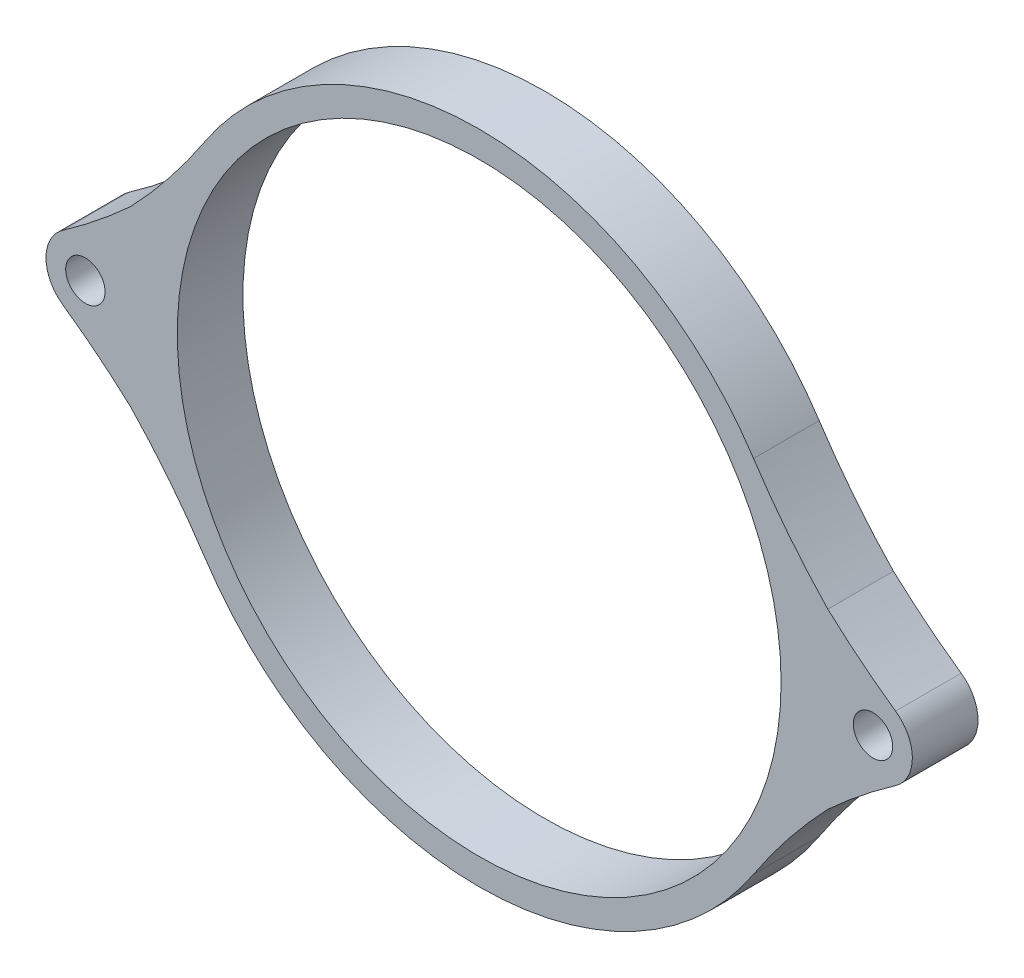
ISO-10303-21;
HEADER;
FILE_DESCRIPTION(('STEP AP214'),'2;1');
FILE_NAME('part.step','',(''),(''),'','','');
FILE_SCHEMA(('AUTOMOTIVE_DESIGN { 1 0 10303 214 1 1 1 1 }'));
ENDSEC;
DATA;
#1=APPLICATION_CONTEXT('core data for automotive mechanical design processes');
#2=APPLICATION_PROTOCOL_DEFINITION('international standard','automotive_design',2000,#1);
#3=PRODUCT_CONTEXT('',#1,'mechanical');
#4=PRODUCT('Part','Part','',(#3));
#5=PRODUCT_RELATED_PRODUCT_CATEGORY('part','',(#4));
#6=PRODUCT_DEFINITION_FORMATION('','',#4);
#7=PRODUCT_DEFINITION_CONTEXT('part definition',#1,'design');
#8=PRODUCT_DEFINITION('design','',#6,#7);
#9=PRODUCT_DEFINITION_SHAPE('','',#8);
#10=(LENGTH_UNIT() NAMED_UNIT(*) SI_UNIT(.MILLI.,.METRE.));
#11=(NAMED_UNIT(*) PLANE_ANGLE_UNIT() SI_UNIT($,.RADIAN.));
#12=(NAMED_UNIT(*) SI_UNIT($,.STERADIAN.) SOLID_ANGLE_UNIT());
#13=UNCERTAINTY_MEASURE_WITH_UNIT(LENGTH_MEASURE(1.E-05),#10,'distance_accuracy_value','');
#14=(GEOMETRIC_REPRESENTATION_CONTEXT(3) GLOBAL_UNCERTAINTY_ASSIGNED_CONTEXT((#13)) GLOBAL_UNIT_ASSIGNED_CONTEXT((#10,
#11,#12)) REPRESENTATION_CONTEXT('',''));
#15=CARTESIAN_POINT('',(0.,0.,0.));
#16=DIRECTION('',(0.,0.,1.));
#17=DIRECTION('',(1.,0.,0.));
#18=AXIS2_PLACEMENT_3D('',#15,#16,#17);
#19=CARTESIAN_POINT('',(0.,0.,5.));
#20=DIRECTION('',(0.,0.,-1.));
#21=DIRECTION('',(-1.,0.,0.));
#22=AXIS2_PLACEMENT_3D('',#19,#20,#21);
#23=CYLINDRICAL_SURFACE('',#22,25.);
#24=CARTESIAN_POINT('',(0.,0.,5.));
#25=DIRECTION('',(0.,0.,1.));
#26=DIRECTION('',(1.,0.,0.));
#27=AXIS2_PLACEMENT_3D('',#24,#25,#26);
#28=CIRCLE('',#27,25.);
#29=CARTESIAN_POINT('',(20.9015909610974,13.7158118715216,5.));
#30=VERTEX_POINT('',#29);
#31=CARTESIAN_POINT('',(-20.9015909610974,13.7158118715216,5.));
#32=VERTEX_POINT('',#31);
#33=EDGE_CURVE('E247',#30,#32,#28,.T.);
#34=ORIENTED_EDGE('',*,*,#33,.F.);
#35=DIRECTION('',(0.,0.,-1.));
#36=VECTOR('',#35,1.);
#37=CARTESIAN_POINT('',(20.9015909610974,13.7158118715216,5.));
#38=LINE('',#37,#36);
#39=CARTESIAN_POINT('',(20.9015909610974,13.7158118715216,0.));
#40=VERTEX_POINT('',#39);
#41=EDGE_CURVE('E170',#30,#40,#38,.T.);
#42=ORIENTED_EDGE('',*,*,#41,.T.);
#43=CARTESIAN_POINT('',(0.,0.,0.));
#44=DIRECTION('',(0.,0.,1.));
#45=DIRECTION('',(1.,0.,0.));
#46=AXIS2_PLACEMENT_3D('',#43,#44,#45);
#47=CIRCLE('',#46,25.);
#48=CARTESIAN_POINT('',(-20.9015909610974,13.7158118715216,0.));
#49=VERTEX_POINT('',#48);
#50=EDGE_CURVE('E216',#40,#49,#47,.T.);
#51=ORIENTED_EDGE('',*,*,#50,.T.);
#52=DIRECTION('',(0.,0.,-1.));
#53=VECTOR('',#52,1.);
#54=CARTESIAN_POINT('',(-20.9015909610974,13.7158118715216,5.));
#55=LINE('',#54,#53);
#56=EDGE_CURVE('E168',#49,#32,#55,.F.);
#57=ORIENTED_EDGE('',*,*,#56,.T.);
#58=EDGE_LOOP('',(#34,#42,#51,#57));
#59=FACE_BOUND('',#58,.T.);
#60=ADVANCED_FACE('F38',(#59),#23,.T.);
#61=CARTESIAN_POINT('',(-30.,0.,5.));
#62=DIRECTION('',(0.,0.,-1.));
#63=DIRECTION('',(-1.,0.,0.));
#64=AXIS2_PLACEMENT_3D('',#61,#62,#63);
#65=CYLINDRICAL_SURFACE('',#64,3.);
#66=CARTESIAN_POINT('',(-30.,0.,5.));
#67=DIRECTION('',(0.,0.,1.));
#68=DIRECTION('',(1.,0.,0.));
#69=AXIS2_PLACEMENT_3D('',#66,#67,#68);
#70=CIRCLE('',#69,3.);
#71=CARTESIAN_POINT('',(-31.7190766718324,2.45861249414417,5.));
#72=VERTEX_POINT('',#71);
#73=CARTESIAN_POINT('',(-31.7190766718324,-2.45861249414417,5.));
#74=VERTEX_POINT('',#73);
#75=EDGE_CURVE('E225',#72,#74,#70,.T.);
#76=ORIENTED_EDGE('',*,*,#75,.F.);
#77=DIRECTION('',(0.,0.,-1.));
#78=VECTOR('',#77,1.);
#79=CARTESIAN_POINT('',(-31.7190766718324,2.45861249414417,5.));
#80=LINE('',#79,#78);
#81=CARTESIAN_POINT('',(-31.7190766718324,2.45861249414417,0.));
#82=VERTEX_POINT('',#81);
#83=EDGE_CURVE('E141',#72,#82,#80,.T.);
#84=ORIENTED_EDGE('',*,*,#83,.T.);
#85=CARTESIAN_POINT('',(-30.,0.,0.));
#86=DIRECTION('',(0.,0.,1.));
#87=DIRECTION('',(1.,0.,0.));
#88=AXIS2_PLACEMENT_3D('',#85,#86,#87);
#89=CIRCLE('',#88,3.);
#90=CARTESIAN_POINT('',(-31.7190766718324,-2.45861249414417,0.));
#91=VERTEX_POINT('',#90);
#92=EDGE_CURVE('E210',#82,#91,#89,.T.);
#93=ORIENTED_EDGE('',*,*,#92,.T.);
#94=DIRECTION('',(0.,0.,-1.));
#95=VECTOR('',#94,1.);
#96=CARTESIAN_POINT('',(-31.7190766718324,-2.45861249414417,5.));
#97=LINE('',#96,#95);
#98=EDGE_CURVE('E53',#91,#74,#97,.F.);
#99=ORIENTED_EDGE('',*,*,#98,.T.);
#100=EDGE_LOOP('',(#76,#84,#93,#99));
#101=FACE_BOUND('',#100,.T.);
#102=ADVANCED_FACE('F213',(#101),#65,.T.);
#103=CARTESIAN_POINT('',(-20.9015909610974,-13.7158118715216,0.));
#104=VERTEX_POINT('',#103);
#105=CARTESIAN_POINT('',(20.9015909610974,-13.7158118715216,0.));
#106=VERTEX_POINT('',#105);
#107=EDGE_CURVE('E215',#104,#106,#47,.T.);
#108=ORIENTED_EDGE('',*,*,#107,.T.);
#109=DIRECTION('',(0.,0.,-1.));
#110=VECTOR('',#109,1.);
#111=CARTESIAN_POINT('',(20.9015909610974,-13.7158118715216,5.));
#112=LINE('',#111,#110);
#113=CARTESIAN_POINT('',(20.9015909610974,-13.7158118715216,5.));
#114=VERTEX_POINT('',#113);
#115=EDGE_CURVE('E150',#106,#114,#112,.F.);
#116=ORIENTED_EDGE('',*,*,#115,.T.);
#117=CARTESIAN_POINT('',(-20.9015909610974,-13.7158118715216,5.));
#118=VERTEX_POINT('',#117);
#119=EDGE_CURVE('E231',#118,#114,#28,.T.);
#120=ORIENTED_EDGE('',*,*,#119,.F.);
#121=DIRECTION('',(0.,0.,-1.));
#122=VECTOR('',#121,1.);
#123=CARTESIAN_POINT('',(-20.9015909610974,-13.7158118715216,5.));
#124=LINE('',#123,#122);
#125=EDGE_CURVE('E155',#118,#104,#124,.T.);
#126=ORIENTED_EDGE('',*,*,#125,.T.);
#127=EDGE_LOOP('',(#108,#116,#120,#126));
#128=FACE_BOUND('',#127,.T.);
#129=ADVANCED_FACE('F230',(#128),#23,.T.);
#130=CARTESIAN_POINT('',(30.,0.,5.));
#131=DIRECTION('',(0.,0.,-1.));
#132=DIRECTION('',(-1.,0.,0.));
#133=AXIS2_PLACEMENT_3D('',#130,#131,#132);
#134=CYLINDRICAL_SURFACE('',#133,1.5);
#135=CARTESIAN_POINT('',(30.,0.,5.));
#136=DIRECTION('',(0.,0.,1.));
#137=DIRECTION('',(1.,0.,0.));
#138=AXIS2_PLACEMENT_3D('',#135,#136,#137);
#139=CIRCLE('',#138,1.5);
#140=CARTESIAN_POINT('',(31.5,0.,5.));
#141=VERTEX_POINT('',#140);
#142=EDGE_CURVE('E161',#141,#141,#139,.T.);
#143=ORIENTED_EDGE('',*,*,#142,.T.);
#144=EDGE_LOOP('',(#143));
#145=FACE_BOUND('',#144,.T.);
#146=CARTESIAN_POINT('',(30.,0.,0.));
#147=DIRECTION('',(0.,0.,1.));
#148=DIRECTION('',(1.,0.,0.));
#149=AXIS2_PLACEMENT_3D('',#146,#147,#148);
#150=CIRCLE('',#149,1.5);
#151=CARTESIAN_POINT('',(31.5,0.,0.));
#152=VERTEX_POINT('',#151);
#153=EDGE_CURVE('E252',#152,#152,#150,.T.);
#154=ORIENTED_EDGE('',*,*,#153,.F.);
#155=EDGE_LOOP('',(#154));
#156=FACE_BOUND('',#155,.T.);
#157=ADVANCED_FACE('F264',(#145,#156),#134,.F.);
#158=CARTESIAN_POINT('',(0.,0.,5.));
#159=DIRECTION('',(0.,0.,-1.));
#160=DIRECTION('',(-1.,0.,0.));
#161=AXIS2_PLACEMENT_3D('',#158,#159,#160);
#162=CYLINDRICAL_SURFACE('',#161,23.);
#163=CARTESIAN_POINT('',(0.,0.,5.));
#164=DIRECTION('',(0.,0.,1.));
#165=DIRECTION('',(1.,0.,0.));
#166=AXIS2_PLACEMENT_3D('',#163,#164,#165);
#167=CIRCLE('',#166,23.);
#168=CARTESIAN_POINT('',(23.,0.,5.));
#169=VERTEX_POINT('',#168);
#170=EDGE_CURVE('E254',#169,#169,#167,.T.);
#171=ORIENTED_EDGE('',*,*,#170,.T.);
#172=EDGE_LOOP('',(#171));
#173=FACE_BOUND('',#172,.T.);
#174=CARTESIAN_POINT('',(0.,0.,0.));
#175=DIRECTION('',(0.,0.,1.));
#176=DIRECTION('',(1.,0.,0.));
#177=AXIS2_PLACEMENT_3D('',#174,#175,#176);
#178=CIRCLE('',#177,23.);
#179=CARTESIAN_POINT('',(23.,0.,0.));
#180=VERTEX_POINT('',#179);
#181=EDGE_CURVE('E233',#180,#180,#178,.T.);
#182=ORIENTED_EDGE('',*,*,#181,.F.);
#183=EDGE_LOOP('',(#182));
#184=FACE_BOUND('',#183,.T.);
#185=ADVANCED_FACE('F297',(#173,#184),#162,.F.);
#186=CARTESIAN_POINT('',(30.,0.,5.));
#187=DIRECTION('',(0.,0.,-1.));
#188=DIRECTION('',(-1.,0.,0.));
#189=AXIS2_PLACEMENT_3D('',#186,#187,#188);
#190=CYLINDRICAL_SURFACE('',#189,3.);
#191=CARTESIAN_POINT('',(30.,0.,5.));
#192=DIRECTION('',(0.,0.,1.));
#193=DIRECTION('',(1.,0.,0.));
#194=AXIS2_PLACEMENT_3D('',#191,#192,#193);
#195=CIRCLE('',#194,3.);
#196=CARTESIAN_POINT('',(31.7190766718324,-2.45861249414417,5.));
#197=VERTEX_POINT('',#196);
#198=CARTESIAN_POINT('',(31.7190766718324,2.45861249414417,5.));
#199=VERTEX_POINT('',#198);
#200=EDGE_CURVE('E253',#197,#199,#195,.T.);
#201=ORIENTED_EDGE('',*,*,#200,.F.);
#202=DIRECTION('',(0.,0.,-1.));
#203=VECTOR('',#202,1.);
#204=CARTESIAN_POINT('',(31.7190766718324,-2.45861249414417,5.));
#205=LINE('',#204,#203);
#206=CARTESIAN_POINT('',(31.7190766718324,-2.45861249414417,0.));
#207=VERTEX_POINT('',#206);
#208=EDGE_CURVE('E197',#197,#207,#205,.T.);
#209=ORIENTED_EDGE('',*,*,#208,.T.);
#210=CARTESIAN_POINT('',(30.,0.,0.));
#211=DIRECTION('',(0.,0.,1.));
#212=DIRECTION('',(1.,0.,0.));
#213=AXIS2_PLACEMENT_3D('',#210,#211,#212);
#214=CIRCLE('',#213,3.);
#215=CARTESIAN_POINT('',(31.7190766718324,2.45861249414417,0.));
#216=VERTEX_POINT('',#215);
#217=EDGE_CURVE('E135',#207,#216,#214,.T.);
#218=ORIENTED_EDGE('',*,*,#217,.T.);
#219=DIRECTION('',(0.,0.,-1.));
#220=VECTOR('',#219,1.);
#221=CARTESIAN_POINT('',(31.7190766718324,2.45861249414417,5.));
#222=LINE('',#221,#220);
#223=EDGE_CURVE('E195',#216,#199,#222,.F.);
#224=ORIENTED_EDGE('',*,*,#223,.T.);
#225=EDGE_LOOP('',(#201,#209,#218,#224));
#226=FACE_BOUND('',#225,.T.);
#227=ADVANCED_FACE('F275',(#226),#190,.T.);
#228=CARTESIAN_POINT('',(-30.,0.,5.));
#229=DIRECTION('',(0.,0.,-1.));
#230=DIRECTION('',(-1.,0.,0.));
#231=AXIS2_PLACEMENT_3D('',#228,#229,#230);
#232=CYLINDRICAL_SURFACE('',#231,1.5);
#233=CARTESIAN_POINT('',(-30.,0.,5.));
#234=DIRECTION('',(0.,0.,1.));
#235=DIRECTION('',(1.,0.,0.));
#236=AXIS2_PLACEMENT_3D('',#233,#234,#235);
#237=CIRCLE('',#236,1.5);
#238=CARTESIAN_POINT('',(-28.5,0.,5.));
#239=VERTEX_POINT('',#238);
#240=EDGE_CURVE('E156',#239,#239,#237,.T.);
#241=ORIENTED_EDGE('',*,*,#240,.T.);
#242=EDGE_LOOP('',(#241));
#243=FACE_BOUND('',#242,.T.);
#244=CARTESIAN_POINT('',(-30.,0.,0.));
#245=DIRECTION('',(0.,0.,1.));
#246=DIRECTION('',(1.,0.,0.));
#247=AXIS2_PLACEMENT_3D('',#244,#245,#246);
#248=CIRCLE('',#247,1.5);
#249=CARTESIAN_POINT('',(-28.5,0.,0.));
#250=VERTEX_POINT('',#249);
#251=EDGE_CURVE('E164',#250,#250,#248,.T.);
#252=ORIENTED_EDGE('',*,*,#251,.F.);
#253=EDGE_LOOP('',(#252));
#254=FACE_BOUND('',#253,.T.);
#255=ADVANCED_FACE('F269',(#243,#254),#232,.F.);
#256=CARTESIAN_POINT('',(0.,0.,5.));
#257=DIRECTION('',(0.,0.,1.));
#258=DIRECTION('',(1.,0.,0.));
#259=AXIS2_PLACEMENT_3D('',#256,#257,#258);
#260=PLANE('',#259);
#261=ORIENTED_EDGE('',*,*,#200,.T.);
#262=CARTESIAN_POINT('',(60.3703545357049,43.4354873965469,5.));
#263=DIRECTION('',(0.,0.,1.));
#264=DIRECTION('',(1.,0.,0.));
#265=AXIS2_PLACEMENT_3D('',#262,#263,#264);
#266=CIRCLE('',#265,50.);
#267=CARTESIAN_POINT('',(26.5573264001823,6.60236197517717,5.));
#268=VERTEX_POINT('',#267);
#269=EDGE_CURVE('E205',#199,#268,#266,.F.);
#270=ORIENTED_EDGE('',*,*,#269,.T.);
#271=CARTESIAN_POINT('',(62.7047728832921,41.1474356145648,5.));
#272=DIRECTION('',(0.,0.,1.));
#273=DIRECTION('',(1.,0.,0.));
#274=AXIS2_PLACEMENT_3D('',#271,#272,#273);
#275=CIRCLE('',#274,50.);
#276=EDGE_CURVE('E184',#268,#30,#275,.F.);
#277=ORIENTED_EDGE('',*,*,#276,.T.);
#278=ORIENTED_EDGE('',*,*,#33,.T.);
#279=CARTESIAN_POINT('',(-62.7047728832921,41.1474356145648,5.));
#280=DIRECTION('',(0.,0.,1.));
#281=DIRECTION('',(1.,0.,0.));
#282=AXIS2_PLACEMENT_3D('',#279,#280,#281);
#283=CIRCLE('',#282,50.);
#284=CARTESIAN_POINT('',(-26.5573264001823,6.60236197517717,5.));
#285=VERTEX_POINT('',#284);
#286=EDGE_CURVE('E188',#32,#285,#283,.F.);
#287=ORIENTED_EDGE('',*,*,#286,.T.);
#288=CARTESIAN_POINT('',(-60.3703545357049,43.4354873965469,5.));
#289=DIRECTION('',(0.,0.,1.));
#290=DIRECTION('',(1.,0.,0.));
#291=AXIS2_PLACEMENT_3D('',#288,#289,#290);
#292=CIRCLE('',#291,50.);
#293=EDGE_CURVE('E60',#285,#72,#292,.F.);
#294=ORIENTED_EDGE('',*,*,#293,.T.);
#295=ORIENTED_EDGE('',*,*,#75,.T.);
#296=CARTESIAN_POINT('',(-60.3703545357049,-43.4354873965469,5.));
#297=DIRECTION('',(0.,0.,1.));
#298=DIRECTION('',(1.,0.,0.));
#299=AXIS2_PLACEMENT_3D('',#296,#297,#298);
#300=CIRCLE('',#299,50.);
#301=CARTESIAN_POINT('',(-26.5573264001823,-6.60236197517717,5.));
#302=VERTEX_POINT('',#301);
#303=EDGE_CURVE('E11',#74,#302,#300,.F.);
#304=ORIENTED_EDGE('',*,*,#303,.T.);
#305=CARTESIAN_POINT('',(-62.7047728832921,-41.1474356145648,5.));
#306=DIRECTION('',(0.,0.,1.));
#307=DIRECTION('',(1.,0.,0.));
#308=AXIS2_PLACEMENT_3D('',#305,#306,#307);
#309=CIRCLE('',#308,50.);
#310=EDGE_CURVE('E193',#302,#118,#309,.F.);
#311=ORIENTED_EDGE('',*,*,#310,.T.);
#312=ORIENTED_EDGE('',*,*,#119,.T.);
#313=CARTESIAN_POINT('',(62.7047728832921,-41.1474356145648,5.));
#314=DIRECTION('',(0.,0.,1.));
#315=DIRECTION('',(1.,0.,0.));
#316=AXIS2_PLACEMENT_3D('',#313,#314,#315);
#317=CIRCLE('',#316,50.);
#318=CARTESIAN_POINT('',(26.5573264001823,-6.60236197517717,5.));
#319=VERTEX_POINT('',#318);
#320=EDGE_CURVE('E151',#114,#319,#317,.F.);
#321=ORIENTED_EDGE('',*,*,#320,.T.);
#322=CARTESIAN_POINT('',(60.3703545357049,-43.4354873965469,5.));
#323=DIRECTION('',(0.,0.,1.));
#324=DIRECTION('',(1.,0.,0.));
#325=AXIS2_PLACEMENT_3D('',#322,#323,#324);
#326=CIRCLE('',#325,50.);
#327=EDGE_CURVE('E140',#319,#197,#326,.F.);
#328=ORIENTED_EDGE('',*,*,#327,.T.);
#329=EDGE_LOOP('',(#261,#270,#277,#278,#287,#294,#295,#304,#311,#312,#321,#328));
#330=FACE_BOUND('',#329,.T.);
#331=ORIENTED_EDGE('',*,*,#170,.F.);
#332=EDGE_LOOP('',(#331));
#333=FACE_BOUND('',#332,.T.);
#334=ORIENTED_EDGE('',*,*,#142,.F.);
#335=EDGE_LOOP('',(#334));
#336=FACE_BOUND('',#335,.T.);
#337=ORIENTED_EDGE('',*,*,#240,.F.);
#338=EDGE_LOOP('',(#337));
#339=FACE_BOUND('',#338,.T.);
#340=ADVANCED_FACE('F221',(#330,#333,#336,#339),#260,.T.);
#341=CARTESIAN_POINT('',(0.,0.,0.));
#342=DIRECTION('',(0.,0.,1.));
#343=DIRECTION('',(1.,0.,0.));
#344=AXIS2_PLACEMENT_3D('',#341,#342,#343);
#345=PLANE('',#344);
#346=CARTESIAN_POINT('',(62.7047728832921,41.1474356145648,0.));
#347=DIRECTION('',(0.,0.,1.));
#348=DIRECTION('',(1.,0.,0.));
#349=AXIS2_PLACEMENT_3D('',#346,#347,#348);
#350=CIRCLE('',#349,50.);
#351=CARTESIAN_POINT('',(26.5573264001823,6.60236197517717,0.));
#352=VERTEX_POINT('',#351);
#353=EDGE_CURVE('E182',#40,#352,#350,.T.);
#354=ORIENTED_EDGE('',*,*,#353,.T.);
#355=CARTESIAN_POINT('',(60.3703545357049,43.4354873965469,0.));
#356=DIRECTION('',(0.,0.,1.));
#357=DIRECTION('',(1.,0.,0.));
#358=AXIS2_PLACEMENT_3D('',#355,#356,#357);
#359=CIRCLE('',#358,50.);
#360=EDGE_CURVE('E203',#352,#216,#359,.T.);
#361=ORIENTED_EDGE('',*,*,#360,.T.);
#362=ORIENTED_EDGE('',*,*,#217,.F.);
#363=CARTESIAN_POINT('',(60.3703545357049,-43.4354873965469,0.));
#364=DIRECTION('',(0.,0.,1.));
#365=DIRECTION('',(1.,0.,0.));
#366=AXIS2_PLACEMENT_3D('',#363,#364,#365);
#367=CIRCLE('',#366,50.);
#368=CARTESIAN_POINT('',(26.5573264001823,-6.60236197517717,0.));
#369=VERTEX_POINT('',#368);
#370=EDGE_CURVE('E126',#207,#369,#367,.T.);
#371=ORIENTED_EDGE('',*,*,#370,.T.);
#372=CARTESIAN_POINT('',(62.7047728832921,-41.1474356145648,0.));
#373=DIRECTION('',(0.,0.,1.));
#374=DIRECTION('',(1.,0.,0.));
#375=AXIS2_PLACEMENT_3D('',#372,#373,#374);
#376=CIRCLE('',#375,50.);
#377=EDGE_CURVE('E132',#369,#106,#376,.T.);
#378=ORIENTED_EDGE('',*,*,#377,.T.);
#379=ORIENTED_EDGE('',*,*,#107,.F.);
#380=CARTESIAN_POINT('',(-62.7047728832921,-41.1474356145648,0.));
#381=DIRECTION('',(0.,0.,1.));
#382=DIRECTION('',(1.,0.,0.));
#383=AXIS2_PLACEMENT_3D('',#380,#381,#382);
#384=CIRCLE('',#383,50.);
#385=CARTESIAN_POINT('',(-26.5573264001823,-6.60236197517717,0.));
#386=VERTEX_POINT('',#385);
#387=EDGE_CURVE('E190',#104,#386,#384,.T.);
#388=ORIENTED_EDGE('',*,*,#387,.T.);
#389=CARTESIAN_POINT('',(-60.3703545357049,-43.4354873965469,0.));
#390=DIRECTION('',(0.,0.,1.));
#391=DIRECTION('',(1.,0.,0.));
#392=AXIS2_PLACEMENT_3D('',#389,#390,#391);
#393=CIRCLE('',#392,50.);
#394=EDGE_CURVE('E46',#386,#91,#393,.T.);
#395=ORIENTED_EDGE('',*,*,#394,.T.);
#396=ORIENTED_EDGE('',*,*,#92,.F.);
#397=CARTESIAN_POINT('',(-60.3703545357049,43.4354873965469,0.));
#398=DIRECTION('',(0.,0.,1.));
#399=DIRECTION('',(1.,0.,0.));
#400=AXIS2_PLACEMENT_3D('',#397,#398,#399);
#401=CIRCLE('',#400,50.);
#402=CARTESIAN_POINT('',(-26.5573264001823,6.60236197517717,0.));
#403=VERTEX_POINT('',#402);
#404=EDGE_CURVE('E207',#82,#403,#401,.T.);
#405=ORIENTED_EDGE('',*,*,#404,.T.);
#406=CARTESIAN_POINT('',(-62.7047728832921,41.1474356145648,0.));
#407=DIRECTION('',(0.,0.,1.));
#408=DIRECTION('',(1.,0.,0.));
#409=AXIS2_PLACEMENT_3D('',#406,#407,#408);
#410=CIRCLE('',#409,50.);
#411=EDGE_CURVE('E186',#403,#49,#410,.T.);
#412=ORIENTED_EDGE('',*,*,#411,.T.);
#413=ORIENTED_EDGE('',*,*,#50,.F.);
#414=EDGE_LOOP('',(#354,#361,#362,#371,#378,#379,#388,#395,#396,#405,#412,#413));
#415=FACE_BOUND('',#414,.T.);
#416=ORIENTED_EDGE('',*,*,#181,.T.);
#417=EDGE_LOOP('',(#416));
#418=FACE_BOUND('',#417,.T.);
#419=ORIENTED_EDGE('',*,*,#153,.T.);
#420=EDGE_LOOP('',(#419));
#421=FACE_BOUND('',#420,.T.);
#422=ORIENTED_EDGE('',*,*,#251,.T.);
#423=EDGE_LOOP('',(#422));
#424=FACE_BOUND('',#423,.T.);
#425=ADVANCED_FACE('F129',(#415,#418,#421,#424),#345,.F.);
#426=CARTESIAN_POINT('',(62.7047728832921,-41.1474356145648,5.));
#427=DIRECTION('',(0.,0.,-1.));
#428=DIRECTION('',(-1.,0.,0.));
#429=AXIS2_PLACEMENT_3D('',#426,#427,#428);
#430=CYLINDRICAL_SURFACE('',#429,50.);
#431=ORIENTED_EDGE('',*,*,#320,.F.);
#432=ORIENTED_EDGE('',*,*,#115,.F.);
#433=ORIENTED_EDGE('',*,*,#377,.F.);
#434=DIRECTION('',(0.,0.,-1.));
#435=VECTOR('',#434,1.);
#436=CARTESIAN_POINT('',(26.5573264001823,-6.60236197517717,5.));
#437=LINE('',#436,#435);
#438=EDGE_CURVE('E148',#319,#369,#437,.T.);
#439=ORIENTED_EDGE('',*,*,#438,.F.);
#440=EDGE_LOOP('',(#431,#432,#433,#439));
#441=FACE_BOUND('',#440,.T.);
#442=ADVANCED_FACE('F147',(#441),#430,.F.);
#443=CARTESIAN_POINT('',(62.7047728832921,41.1474356145648,5.));
#444=DIRECTION('',(0.,0.,-1.));
#445=DIRECTION('',(-1.,0.,0.));
#446=AXIS2_PLACEMENT_3D('',#443,#444,#445);
#447=CYLINDRICAL_SURFACE('',#446,50.);
#448=ORIENTED_EDGE('',*,*,#276,.F.);
#449=DIRECTION('',(0.,0.,1.));
#450=VECTOR('',#449,1.);
#451=CARTESIAN_POINT('',(26.5573264001823,6.60236197517717,5.));
#452=LINE('',#451,#450);
#453=EDGE_CURVE('E173',#352,#268,#452,.T.);
#454=ORIENTED_EDGE('',*,*,#453,.F.);
#455=ORIENTED_EDGE('',*,*,#353,.F.);
#456=ORIENTED_EDGE('',*,*,#41,.F.);
#457=EDGE_LOOP('',(#448,#454,#455,#456));
#458=FACE_BOUND('',#457,.T.);
#459=ADVANCED_FACE('F284',(#458),#447,.F.);
#460=CARTESIAN_POINT('',(-62.7047728832921,41.1474356145648,5.));
#461=DIRECTION('',(0.,0.,-1.));
#462=DIRECTION('',(-1.,0.,0.));
#463=AXIS2_PLACEMENT_3D('',#460,#461,#462);
#464=CYLINDRICAL_SURFACE('',#463,50.);
#465=ORIENTED_EDGE('',*,*,#286,.F.);
#466=ORIENTED_EDGE('',*,*,#56,.F.);
#467=ORIENTED_EDGE('',*,*,#411,.F.);
#468=DIRECTION('',(0.,0.,-1.));
#469=VECTOR('',#468,1.);
#470=CARTESIAN_POINT('',(-26.5573264001823,6.60236197517717,5.));
#471=LINE('',#470,#469);
#472=EDGE_CURVE('E176',#285,#403,#471,.T.);
#473=ORIENTED_EDGE('',*,*,#472,.F.);
#474=EDGE_LOOP('',(#465,#466,#467,#473));
#475=FACE_BOUND('',#474,.T.);
#476=ADVANCED_FACE('F245',(#475),#464,.F.);
#477=CARTESIAN_POINT('',(-62.7047728832921,-41.1474356145648,5.));
#478=DIRECTION('',(0.,0.,-1.));
#479=DIRECTION('',(-1.,0.,0.));
#480=AXIS2_PLACEMENT_3D('',#477,#478,#479);
#481=CYLINDRICAL_SURFACE('',#480,50.);
#482=ORIENTED_EDGE('',*,*,#310,.F.);
#483=DIRECTION('',(0.,0.,1.));
#484=VECTOR('',#483,1.);
#485=CARTESIAN_POINT('',(-26.5573264001823,-6.60236197517717,5.));
#486=LINE('',#485,#484);
#487=EDGE_CURVE('E152',#386,#302,#486,.T.);
#488=ORIENTED_EDGE('',*,*,#487,.F.);
#489=ORIENTED_EDGE('',*,*,#387,.F.);
#490=ORIENTED_EDGE('',*,*,#125,.F.);
#491=EDGE_LOOP('',(#482,#488,#489,#490));
#492=FACE_BOUND('',#491,.T.);
#493=ADVANCED_FACE('F228',(#492),#481,.F.);
#494=CARTESIAN_POINT('',(60.3703545357049,-43.4354873965469,5.));
#495=DIRECTION('',(0.,0.,1.));
#496=DIRECTION('',(1.,0.,0.));
#497=AXIS2_PLACEMENT_3D('',#494,#495,#496);
#498=CYLINDRICAL_SURFACE('',#497,50.);
#499=ORIENTED_EDGE('',*,*,#327,.F.);
#500=ORIENTED_EDGE('',*,*,#438,.T.);
#501=ORIENTED_EDGE('',*,*,#370,.F.);
#502=ORIENTED_EDGE('',*,*,#208,.F.);
#503=EDGE_LOOP('',(#499,#500,#501,#502));
#504=FACE_BOUND('',#503,.T.);
#505=ADVANCED_FACE('F154',(#504),#498,.F.);
#506=CARTESIAN_POINT('',(60.3703545357049,43.4354873965469,5.));
#507=DIRECTION('',(0.,0.,1.));
#508=DIRECTION('',(1.,0.,0.));
#509=AXIS2_PLACEMENT_3D('',#506,#507,#508);
#510=CYLINDRICAL_SURFACE('',#509,50.);
#511=ORIENTED_EDGE('',*,*,#269,.F.);
#512=ORIENTED_EDGE('',*,*,#223,.F.);
#513=ORIENTED_EDGE('',*,*,#360,.F.);
#514=ORIENTED_EDGE('',*,*,#453,.T.);
#515=EDGE_LOOP('',(#511,#512,#513,#514));
#516=FACE_BOUND('',#515,.T.);
#517=ADVANCED_FACE('F310',(#516),#510,.F.);
#518=CARTESIAN_POINT('',(-60.3703545357049,43.4354873965469,5.));
#519=DIRECTION('',(0.,0.,1.));
#520=DIRECTION('',(1.,0.,0.));
#521=AXIS2_PLACEMENT_3D('',#518,#519,#520);
#522=CYLINDRICAL_SURFACE('',#521,50.);
#523=ORIENTED_EDGE('',*,*,#293,.F.);
#524=ORIENTED_EDGE('',*,*,#472,.T.);
#525=ORIENTED_EDGE('',*,*,#404,.F.);
#526=ORIENTED_EDGE('',*,*,#83,.F.);
#527=EDGE_LOOP('',(#523,#524,#525,#526));
#528=FACE_BOUND('',#527,.T.);
#529=ADVANCED_FACE('F325',(#528),#522,.F.);
#530=CARTESIAN_POINT('',(-60.3703545357049,-43.4354873965469,5.));
#531=DIRECTION('',(0.,0.,1.));
#532=DIRECTION('',(1.,0.,0.));
#533=AXIS2_PLACEMENT_3D('',#530,#531,#532);
#534=CYLINDRICAL_SURFACE('',#533,50.);
#535=ORIENTED_EDGE('',*,*,#303,.F.);
#536=ORIENTED_EDGE('',*,*,#98,.F.);
#537=ORIENTED_EDGE('',*,*,#394,.F.);
#538=ORIENTED_EDGE('',*,*,#487,.T.);
#539=EDGE_LOOP('',(#535,#536,#537,#538));
#540=FACE_BOUND('',#539,.T.);
#541=ADVANCED_FACE('F40',(#540),#534,.F.);
#542=CLOSED_SHELL('',(#60,#102,#129,#157,#185,#227,#255,#340,#425,#442,#459,#476,#493,#505,#517,
#529,#541));
#543=MANIFOLD_SOLID_BREP('B2',#542);
#544=ADVANCED_BREP_SHAPE_REPRESENTATION('',(#18,#543),#14);
#545=SHAPE_DEFINITION_REPRESENTATION(#9,#544);
ENDSEC;
END-ISO-10303-21;
